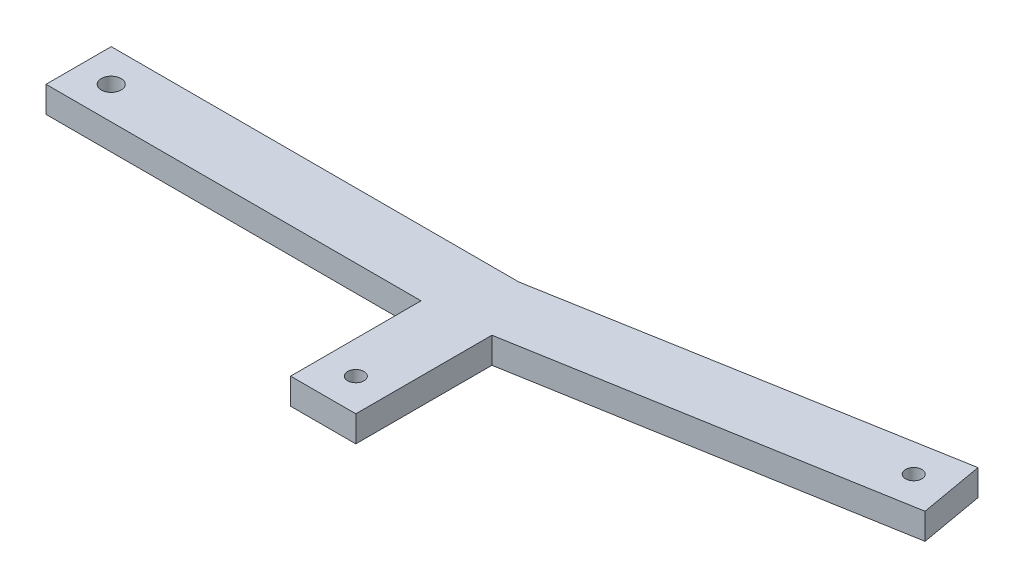
ISO-10303-21;
HEADER;
FILE_DESCRIPTION(('STEP AP214'),'2;1');
FILE_NAME('part.step','',(''),(''),'','','');
FILE_SCHEMA(('AUTOMOTIVE_DESIGN { 1 0 10303 214 1 1 1 1 }'));
ENDSEC;
DATA;
#1=APPLICATION_CONTEXT('core data for automotive mechanical design processes');
#2=APPLICATION_PROTOCOL_DEFINITION('international standard','automotive_design',2000,#1);
#3=PRODUCT_CONTEXT('',#1,'mechanical');
#4=PRODUCT('Part','Part','',(#3));
#5=PRODUCT_RELATED_PRODUCT_CATEGORY('part','',(#4));
#6=PRODUCT_DEFINITION_FORMATION('','',#4);
#7=PRODUCT_DEFINITION_CONTEXT('part definition',#1,'design');
#8=PRODUCT_DEFINITION('design','',#6,#7);
#9=PRODUCT_DEFINITION_SHAPE('','',#8);
#10=(LENGTH_UNIT() NAMED_UNIT(*) SI_UNIT(.MILLI.,.METRE.));
#11=(NAMED_UNIT(*) PLANE_ANGLE_UNIT() SI_UNIT($,.RADIAN.));
#12=(NAMED_UNIT(*) SI_UNIT($,.STERADIAN.) SOLID_ANGLE_UNIT());
#13=UNCERTAINTY_MEASURE_WITH_UNIT(LENGTH_MEASURE(1.E-05),#10,'distance_accuracy_value','');
#14=(GEOMETRIC_REPRESENTATION_CONTEXT(3) GLOBAL_UNCERTAINTY_ASSIGNED_CONTEXT((#13)) GLOBAL_UNIT_ASSIGNED_CONTEXT((#10,
#11,#12)) REPRESENTATION_CONTEXT('',''));
#15=CARTESIAN_POINT('',(0.,0.,0.));
#16=DIRECTION('',(0.,0.,1.));
#17=DIRECTION('',(1.,0.,0.));
#18=AXIS2_PLACEMENT_3D('',#15,#16,#17);
#19=CARTESIAN_POINT('',(0.,8.,0.));
#20=DIRECTION('',(0.,-1.,0.));
#21=DIRECTION('',(0.,0.,-1.));
#22=AXIS2_PLACEMENT_3D('',#19,#20,#21);
#23=PLANE('',#22);
#24=CARTESIAN_POINT('',(-39.1381945492979,8.,0.));
#25=DIRECTION('',(0.,1.,0.));
#26=DIRECTION('',(0.,0.,1.));
#27=AXIS2_PLACEMENT_3D('',#24,#25,#26);
#28=CIRCLE('',#27,3.05);
#29=CARTESIAN_POINT('',(-39.1381945492979,8.,3.05));
#30=VERTEX_POINT('',#29);
#31=EDGE_CURVE('E198',#30,#30,#28,.T.);
#32=ORIENTED_EDGE('',*,*,#31,.F.);
#33=EDGE_LOOP('',(#32));
#34=FACE_BOUND('',#33,.T.);
#35=DIRECTION('',(-1.,0.,0.));
#36=VECTOR('',#35,1.);
#37=CARTESIAN_POINT('',(75.8618054507021,8.,-10.));
#38=LINE('',#37,#36);
#39=CARTESIAN_POINT('',(75.8618054507021,8.,-10.));
#40=VERTEX_POINT('',#39);
#41=CARTESIAN_POINT('',(-49.1381945492979,8.,-10.));
#42=VERTEX_POINT('',#41);
#43=EDGE_CURVE('E154',#40,#42,#38,.T.);
#44=ORIENTED_EDGE('',*,*,#43,.T.);
#45=DIRECTION('',(0.,0.,1.));
#46=VECTOR('',#45,1.);
#47=CARTESIAN_POINT('',(-49.1381945492979,8.,10.));
#48=LINE('',#47,#46);
#49=CARTESIAN_POINT('',(-49.1381945492979,8.,10.));
#50=VERTEX_POINT('',#49);
#51=EDGE_CURVE('E96',#42,#50,#48,.T.);
#52=ORIENTED_EDGE('',*,*,#51,.T.);
#53=DIRECTION('',(1.,0.,0.));
#54=VECTOR('',#53,1.);
#55=CARTESIAN_POINT('',(65.8618054507021,8.,9.99999999999999));
#56=LINE('',#55,#54);
#57=CARTESIAN_POINT('',(65.8618054507021,8.,9.99999999999999));
#58=VERTEX_POINT('',#57);
#59=EDGE_CURVE('E172',#50,#58,#56,.T.);
#60=ORIENTED_EDGE('',*,*,#59,.T.);
#61=DIRECTION('',(0.,0.,1.));
#62=VECTOR('',#61,1.);
#63=CARTESIAN_POINT('',(65.8618054507021,8.,50.));
#64=LINE('',#63,#62);
#65=CARTESIAN_POINT('',(65.8618054507021,8.,50.));
#66=VERTEX_POINT('',#65);
#67=EDGE_CURVE('E188',#58,#66,#64,.T.);
#68=ORIENTED_EDGE('',*,*,#67,.T.);
#69=DIRECTION('',(1.,0.,0.));
#70=VECTOR('',#69,1.);
#71=CARTESIAN_POINT('',(75.8618054507021,8.,50.));
#72=LINE('',#71,#70);
#73=CARTESIAN_POINT('',(85.8618054507021,8.,50.));
#74=VERTEX_POINT('',#73);
#75=EDGE_CURVE('E187',#66,#74,#72,.T.);
#76=ORIENTED_EDGE('',*,*,#75,.T.);
#77=DIRECTION('',(0.,0.,-1.));
#78=VECTOR('',#77,1.);
#79=CARTESIAN_POINT('',(85.8618054507021,8.,50.));
#80=LINE('',#79,#78);
#81=CARTESIAN_POINT('',(85.8618054507021,8.,8.26328529359308));
#82=VERTEX_POINT('',#81);
#83=EDGE_CURVE('E118',#74,#82,#80,.T.);
#84=ORIENTED_EDGE('',*,*,#83,.T.);
#85=DIRECTION('',(0.985251905584883,0.,-0.171110147394471));
#86=VECTOR('',#85,1.);
#87=CARTESIAN_POINT('',(85.8618054507021,8.,8.26328529359308));
#88=LINE('',#87,#86);
#89=CARTESIAN_POINT('',(199.018293648812,8.,-11.3887684243089));
#90=VERTEX_POINT('',#89);
#91=EDGE_CURVE('E112',#82,#90,#88,.T.);
#92=ORIENTED_EDGE('',*,*,#91,.T.);
#93=DIRECTION('',(-0.173648177666931,0.,-0.984807753012208));
#94=VECTOR('',#93,1.);
#95=CARTESIAN_POINT('',(195.542164518357,8.,-31.1028763645046));
#96=LINE('',#95,#94);
#97=CARTESIAN_POINT('',(195.542164518357,8.,-31.1028763645046));
#98=VERTEX_POINT('',#97);
#99=EDGE_CURVE('E116',#90,#98,#96,.T.);
#100=ORIENTED_EDGE('',*,*,#99,.T.);
#101=DIRECTION('',(-0.984807753012208,0.,0.173648177666931));
#102=VECTOR('',#101,1.);
#103=CARTESIAN_POINT('',(75.8618054507021,8.,-10.));
#104=LINE('',#103,#102);
#105=EDGE_CURVE('E50',#98,#40,#104,.T.);
#106=ORIENTED_EDGE('',*,*,#105,.T.);
#107=EDGE_LOOP('',(#44,#52,#60,#68,#76,#84,#92,#100,#106));
#108=FACE_BOUND('',#107,.T.);
#109=CARTESIAN_POINT('',(75.8618054507021,8.,40.));
#110=DIRECTION('',(0.,1.,0.));
#111=DIRECTION('',(0.,0.,1.));
#112=AXIS2_PLACEMENT_3D('',#109,#110,#111);
#113=CIRCLE('',#112,2.5);
#114=CARTESIAN_POINT('',(75.8618054507021,8.,42.5));
#115=VERTEX_POINT('',#114);
#116=EDGE_CURVE('E140',#115,#115,#113,.T.);
#117=ORIENTED_EDGE('',*,*,#116,.F.);
#118=EDGE_LOOP('',(#117));
#119=FACE_BOUND('',#118,.T.);
#120=CARTESIAN_POINT('',(187.432151553463,8.,-19.5093406177375));
#121=DIRECTION('',(0.,1.,0.));
#122=DIRECTION('',(0.,0.,1.));
#123=AXIS2_PLACEMENT_3D('',#120,#121,#122);
#124=CIRCLE('',#123,2.5);
#125=CARTESIAN_POINT('',(187.432151553463,8.,-17.0093406177375));
#126=VERTEX_POINT('',#125);
#127=EDGE_CURVE('E204',#126,#126,#124,.T.);
#128=ORIENTED_EDGE('',*,*,#127,.F.);
#129=EDGE_LOOP('',(#128));
#130=FACE_BOUND('',#129,.T.);
#131=ADVANCED_FACE('F33',(#34,#108,#119,#130),#23,.F.);
#132=CARTESIAN_POINT('',(0.,0.,0.));
#133=DIRECTION('',(0.,-1.,0.));
#134=DIRECTION('',(0.,0.,-1.));
#135=AXIS2_PLACEMENT_3D('',#132,#133,#134);
#136=PLANE('',#135);
#137=CARTESIAN_POINT('',(-39.1381945492979,0.,0.));
#138=DIRECTION('',(0.,1.,0.));
#139=DIRECTION('',(0.,0.,1.));
#140=AXIS2_PLACEMENT_3D('',#137,#138,#139);
#141=CIRCLE('',#140,3.05);
#142=CARTESIAN_POINT('',(-39.1381945492979,0.,3.05));
#143=VERTEX_POINT('',#142);
#144=EDGE_CURVE('E201',#143,#143,#141,.T.);
#145=ORIENTED_EDGE('',*,*,#144,.T.);
#146=EDGE_LOOP('',(#145));
#147=FACE_BOUND('',#146,.T.);
#148=DIRECTION('',(-1.,0.,0.));
#149=VECTOR('',#148,1.);
#150=CARTESIAN_POINT('',(75.8618054507021,0.,-10.));
#151=LINE('',#150,#149);
#152=CARTESIAN_POINT('',(75.8618054507021,0.,-10.));
#153=VERTEX_POINT('',#152);
#154=CARTESIAN_POINT('',(-49.1381945492979,0.,-10.));
#155=VERTEX_POINT('',#154);
#156=EDGE_CURVE('E136',#153,#155,#151,.T.);
#157=ORIENTED_EDGE('',*,*,#156,.F.);
#158=DIRECTION('',(-0.984807753012208,0.,0.173648177666931));
#159=VECTOR('',#158,1.);
#160=CARTESIAN_POINT('',(75.8618054507021,0.,-10.));
#161=LINE('',#160,#159);
#162=CARTESIAN_POINT('',(195.542164518357,0.,-31.1028763645046));
#163=VERTEX_POINT('',#162);
#164=EDGE_CURVE('E88',#163,#153,#161,.T.);
#165=ORIENTED_EDGE('',*,*,#164,.F.);
#166=DIRECTION('',(-0.173648177666931,0.,-0.984807753012208));
#167=VECTOR('',#166,1.);
#168=CARTESIAN_POINT('',(195.542164518357,0.,-31.1028763645046));
#169=LINE('',#168,#167);
#170=CARTESIAN_POINT('',(199.018293648812,0.,-11.3887684243089));
#171=VERTEX_POINT('',#170);
#172=EDGE_CURVE('E82',#171,#163,#169,.T.);
#173=ORIENTED_EDGE('',*,*,#172,.F.);
#174=DIRECTION('',(0.985251905584883,0.,-0.171110147394471));
#175=VECTOR('',#174,1.);
#176=CARTESIAN_POINT('',(85.8618054507021,0.,8.26328529359308));
#177=LINE('',#176,#175);
#178=CARTESIAN_POINT('',(85.8618054507021,0.,8.26328529359308));
#179=VERTEX_POINT('',#178);
#180=EDGE_CURVE('E126',#179,#171,#177,.T.);
#181=ORIENTED_EDGE('',*,*,#180,.F.);
#182=DIRECTION('',(0.,0.,-1.));
#183=VECTOR('',#182,1.);
#184=CARTESIAN_POINT('',(85.8618054507021,0.,50.));
#185=LINE('',#184,#183);
#186=CARTESIAN_POINT('',(85.8618054507021,0.,50.));
#187=VERTEX_POINT('',#186);
#188=EDGE_CURVE('E149',#187,#179,#185,.T.);
#189=ORIENTED_EDGE('',*,*,#188,.F.);
#190=DIRECTION('',(1.,0.,0.));
#191=VECTOR('',#190,1.);
#192=CARTESIAN_POINT('',(75.8618054507021,0.,50.));
#193=LINE('',#192,#191);
#194=CARTESIAN_POINT('',(65.8618054507021,0.,50.));
#195=VERTEX_POINT('',#194);
#196=EDGE_CURVE('E147',#195,#187,#193,.T.);
#197=ORIENTED_EDGE('',*,*,#196,.F.);
#198=DIRECTION('',(0.,0.,1.));
#199=VECTOR('',#198,1.);
#200=CARTESIAN_POINT('',(65.8618054507021,0.,50.));
#201=LINE('',#200,#199);
#202=CARTESIAN_POINT('',(65.8618054507021,0.,9.99999999999999));
#203=VERTEX_POINT('',#202);
#204=EDGE_CURVE('E144',#203,#195,#201,.T.);
#205=ORIENTED_EDGE('',*,*,#204,.F.);
#206=DIRECTION('',(1.,0.,0.));
#207=VECTOR('',#206,1.);
#208=CARTESIAN_POINT('',(65.8618054507021,0.,9.99999999999999));
#209=LINE('',#208,#207);
#210=CARTESIAN_POINT('',(-49.1381945492979,0.,10.));
#211=VERTEX_POINT('',#210);
#212=EDGE_CURVE('E142',#211,#203,#209,.T.);
#213=ORIENTED_EDGE('',*,*,#212,.F.);
#214=DIRECTION('',(0.,0.,1.));
#215=VECTOR('',#214,1.);
#216=CARTESIAN_POINT('',(-49.1381945492979,0.,10.));
#217=LINE('',#216,#215);
#218=EDGE_CURVE('E139',#155,#211,#217,.T.);
#219=ORIENTED_EDGE('',*,*,#218,.F.);
#220=EDGE_LOOP('',(#157,#165,#173,#181,#189,#197,#205,#213,#219));
#221=FACE_BOUND('',#220,.T.);
#222=CARTESIAN_POINT('',(75.8618054507021,0.,40.));
#223=DIRECTION('',(0.,1.,0.));
#224=DIRECTION('',(0.,0.,1.));
#225=AXIS2_PLACEMENT_3D('',#222,#223,#224);
#226=CIRCLE('',#225,2.5);
#227=CARTESIAN_POINT('',(75.8618054507021,0.,42.5));
#228=VERTEX_POINT('',#227);
#229=EDGE_CURVE('E195',#228,#228,#226,.T.);
#230=ORIENTED_EDGE('',*,*,#229,.T.);
#231=EDGE_LOOP('',(#230));
#232=FACE_BOUND('',#231,.T.);
#233=CARTESIAN_POINT('',(187.432151553463,0.,-19.5093406177375));
#234=DIRECTION('',(0.,1.,0.));
#235=DIRECTION('',(0.,0.,1.));
#236=AXIS2_PLACEMENT_3D('',#233,#234,#235);
#237=CIRCLE('',#236,2.5);
#238=CARTESIAN_POINT('',(187.432151553463,0.,-17.0093406177375));
#239=VERTEX_POINT('',#238);
#240=EDGE_CURVE('E207',#239,#239,#237,.T.);
#241=ORIENTED_EDGE('',*,*,#240,.T.);
#242=EDGE_LOOP('',(#241));
#243=FACE_BOUND('',#242,.T.);
#244=ADVANCED_FACE('F176',(#147,#221,#232,#243),#136,.T.);
#245=CARTESIAN_POINT('',(75.8618054507021,8.,-10.));
#246=DIRECTION('',(0.,0.,1.));
#247=DIRECTION('',(1.,0.,0.));
#248=AXIS2_PLACEMENT_3D('',#245,#246,#247);
#249=PLANE('',#248);
#250=ORIENTED_EDGE('',*,*,#156,.T.);
#251=DIRECTION('',(0.,-1.,0.));
#252=VECTOR('',#251,1.);
#253=CARTESIAN_POINT('',(-49.1381945492979,8.,-10.));
#254=LINE('',#253,#252);
#255=EDGE_CURVE('E11',#42,#155,#254,.T.);
#256=ORIENTED_EDGE('',*,*,#255,.F.);
#257=ORIENTED_EDGE('',*,*,#43,.F.);
#258=DIRECTION('',(0.,-1.,0.));
#259=VECTOR('',#258,1.);
#260=CARTESIAN_POINT('',(75.8618054507021,8.,-10.));
#261=LINE('',#260,#259);
#262=EDGE_CURVE('E132',#40,#153,#261,.T.);
#263=ORIENTED_EDGE('',*,*,#262,.T.);
#264=EDGE_LOOP('',(#250,#256,#257,#263));
#265=FACE_BOUND('',#264,.T.);
#266=ADVANCED_FACE('F35',(#265),#249,.F.);
#267=CARTESIAN_POINT('',(-49.1381945492979,8.,10.));
#268=DIRECTION('',(1.,0.,0.));
#269=DIRECTION('',(0.,0.,-1.));
#270=AXIS2_PLACEMENT_3D('',#267,#268,#269);
#271=PLANE('',#270);
#272=ORIENTED_EDGE('',*,*,#218,.T.);
#273=DIRECTION('',(0.,-1.,0.));
#274=VECTOR('',#273,1.);
#275=CARTESIAN_POINT('',(-49.1381945492979,8.,10.));
#276=LINE('',#275,#274);
#277=EDGE_CURVE('E42',#50,#211,#276,.T.);
#278=ORIENTED_EDGE('',*,*,#277,.F.);
#279=ORIENTED_EDGE('',*,*,#51,.F.);
#280=ORIENTED_EDGE('',*,*,#255,.T.);
#281=EDGE_LOOP('',(#272,#278,#279,#280));
#282=FACE_BOUND('',#281,.T.);
#283=ADVANCED_FACE('F245',(#282),#271,.F.);
#284=CARTESIAN_POINT('',(65.8618054507021,8.,9.99999999999999));
#285=DIRECTION('',(0.,0.,-1.));
#286=DIRECTION('',(-1.,0.,0.));
#287=AXIS2_PLACEMENT_3D('',#284,#285,#286);
#288=PLANE('',#287);
#289=ORIENTED_EDGE('',*,*,#212,.T.);
#290=DIRECTION('',(0.,-1.,0.));
#291=VECTOR('',#290,1.);
#292=CARTESIAN_POINT('',(65.8618054507021,8.,9.99999999999999));
#293=LINE('',#292,#291);
#294=EDGE_CURVE('E164',#58,#203,#293,.T.);
#295=ORIENTED_EDGE('',*,*,#294,.F.);
#296=ORIENTED_EDGE('',*,*,#59,.F.);
#297=ORIENTED_EDGE('',*,*,#277,.T.);
#298=EDGE_LOOP('',(#289,#295,#296,#297));
#299=FACE_BOUND('',#298,.T.);
#300=ADVANCED_FACE('F170',(#299),#288,.F.);
#301=CARTESIAN_POINT('',(65.8618054507021,8.,50.));
#302=DIRECTION('',(1.,0.,0.));
#303=DIRECTION('',(0.,0.,-1.));
#304=AXIS2_PLACEMENT_3D('',#301,#302,#303);
#305=PLANE('',#304);
#306=ORIENTED_EDGE('',*,*,#204,.T.);
#307=DIRECTION('',(0.,-1.,0.));
#308=VECTOR('',#307,1.);
#309=CARTESIAN_POINT('',(65.8618054507021,8.,50.));
#310=LINE('',#309,#308);
#311=EDGE_CURVE('E161',#66,#195,#310,.T.);
#312=ORIENTED_EDGE('',*,*,#311,.F.);
#313=ORIENTED_EDGE('',*,*,#67,.F.);
#314=ORIENTED_EDGE('',*,*,#294,.T.);
#315=EDGE_LOOP('',(#306,#312,#313,#314));
#316=FACE_BOUND('',#315,.T.);
#317=ADVANCED_FACE('F181',(#316),#305,.F.);
#318=CARTESIAN_POINT('',(75.8618054507021,8.,50.));
#319=DIRECTION('',(0.,0.,-1.));
#320=DIRECTION('',(-1.,0.,0.));
#321=AXIS2_PLACEMENT_3D('',#318,#319,#320);
#322=PLANE('',#321);
#323=ORIENTED_EDGE('',*,*,#196,.T.);
#324=DIRECTION('',(0.,-1.,0.));
#325=VECTOR('',#324,1.);
#326=CARTESIAN_POINT('',(85.8618054507021,8.,50.));
#327=LINE('',#326,#325);
#328=EDGE_CURVE('E158',#74,#187,#327,.T.);
#329=ORIENTED_EDGE('',*,*,#328,.F.);
#330=ORIENTED_EDGE('',*,*,#75,.F.);
#331=ORIENTED_EDGE('',*,*,#311,.T.);
#332=EDGE_LOOP('',(#323,#329,#330,#331));
#333=FACE_BOUND('',#332,.T.);
#334=ADVANCED_FACE('F185',(#333),#322,.F.);
#335=CARTESIAN_POINT('',(85.8618054507021,8.,50.));
#336=DIRECTION('',(-1.,0.,0.));
#337=DIRECTION('',(0.,0.,1.));
#338=AXIS2_PLACEMENT_3D('',#335,#336,#337);
#339=PLANE('',#338);
#340=ORIENTED_EDGE('',*,*,#188,.T.);
#341=DIRECTION('',(0.,-1.,0.));
#342=VECTOR('',#341,1.);
#343=CARTESIAN_POINT('',(85.8618054507021,8.,8.26328529359308));
#344=LINE('',#343,#342);
#345=EDGE_CURVE('E127',#82,#179,#344,.T.);
#346=ORIENTED_EDGE('',*,*,#345,.F.);
#347=ORIENTED_EDGE('',*,*,#83,.F.);
#348=ORIENTED_EDGE('',*,*,#328,.T.);
#349=EDGE_LOOP('',(#340,#346,#347,#348));
#350=FACE_BOUND('',#349,.T.);
#351=ADVANCED_FACE('F236',(#350),#339,.F.);
#352=CARTESIAN_POINT('',(85.8618054507021,8.,8.26328529359308));
#353=DIRECTION('',(-0.171110147394471,0.,-0.985251905584883));
#354=DIRECTION('',(-0.985251905584883,0.,0.171110147394471));
#355=AXIS2_PLACEMENT_3D('',#352,#353,#354);
#356=PLANE('',#355);
#357=ORIENTED_EDGE('',*,*,#180,.T.);
#358=DIRECTION('',(0.,-1.,0.));
#359=VECTOR('',#358,1.);
#360=CARTESIAN_POINT('',(199.018293648812,8.,-11.3887684243089));
#361=LINE('',#360,#359);
#362=EDGE_CURVE('E123',#90,#171,#361,.T.);
#363=ORIENTED_EDGE('',*,*,#362,.F.);
#364=ORIENTED_EDGE('',*,*,#91,.F.);
#365=ORIENTED_EDGE('',*,*,#345,.T.);
#366=EDGE_LOOP('',(#357,#363,#364,#365));
#367=FACE_BOUND('',#366,.T.);
#368=ADVANCED_FACE('F124',(#367),#356,.F.);
#369=CARTESIAN_POINT('',(195.542164518357,8.,-31.1028763645046));
#370=DIRECTION('',(-0.984807753012208,0.,0.173648177666931));
#371=DIRECTION('',(0.173648177666931,0.,0.984807753012208));
#372=AXIS2_PLACEMENT_3D('',#369,#370,#371);
#373=PLANE('',#372);
#374=ORIENTED_EDGE('',*,*,#172,.T.);
#375=DIRECTION('',(0.,-1.,0.));
#376=VECTOR('',#375,1.);
#377=CARTESIAN_POINT('',(195.542164518357,8.,-31.1028763645046));
#378=LINE('',#377,#376);
#379=EDGE_CURVE('E128',#98,#163,#378,.T.);
#380=ORIENTED_EDGE('',*,*,#379,.F.);
#381=ORIENTED_EDGE('',*,*,#99,.F.);
#382=ORIENTED_EDGE('',*,*,#362,.T.);
#383=EDGE_LOOP('',(#374,#380,#381,#382));
#384=FACE_BOUND('',#383,.T.);
#385=ADVANCED_FACE('F130',(#384),#373,.F.);
#386=CARTESIAN_POINT('',(75.8618054507021,8.,-10.));
#387=DIRECTION('',(0.173648177666931,0.,0.984807753012208));
#388=DIRECTION('',(0.984807753012208,0.,-0.173648177666931));
#389=AXIS2_PLACEMENT_3D('',#386,#387,#388);
#390=PLANE('',#389);
#391=ORIENTED_EDGE('',*,*,#164,.T.);
#392=ORIENTED_EDGE('',*,*,#262,.F.);
#393=ORIENTED_EDGE('',*,*,#105,.F.);
#394=ORIENTED_EDGE('',*,*,#379,.T.);
#395=EDGE_LOOP('',(#391,#392,#393,#394));
#396=FACE_BOUND('',#395,.T.);
#397=ADVANCED_FACE('F229',(#396),#390,.F.);
#398=CARTESIAN_POINT('',(75.8618054507021,8.,40.));
#399=DIRECTION('',(0.,-1.,0.));
#400=DIRECTION('',(0.,0.,-1.));
#401=AXIS2_PLACEMENT_3D('',#398,#399,#400);
#402=CYLINDRICAL_SURFACE('',#401,2.5);
#403=ORIENTED_EDGE('',*,*,#116,.T.);
#404=EDGE_LOOP('',(#403));
#405=FACE_BOUND('',#404,.T.);
#406=ORIENTED_EDGE('',*,*,#229,.F.);
#407=EDGE_LOOP('',(#406));
#408=FACE_BOUND('',#407,.T.);
#409=ADVANCED_FACE('F226',(#405,#408),#402,.F.);
#410=CARTESIAN_POINT('',(-39.1381945492979,8.,0.));
#411=DIRECTION('',(0.,-1.,0.));
#412=DIRECTION('',(0.,0.,-1.));
#413=AXIS2_PLACEMENT_3D('',#410,#411,#412);
#414=CYLINDRICAL_SURFACE('',#413,3.05);
#415=ORIENTED_EDGE('',*,*,#31,.T.);
#416=EDGE_LOOP('',(#415));
#417=FACE_BOUND('',#416,.T.);
#418=ORIENTED_EDGE('',*,*,#144,.F.);
#419=EDGE_LOOP('',(#418));
#420=FACE_BOUND('',#419,.T.);
#421=ADVANCED_FACE('F317',(#417,#420),#414,.F.);
#422=CARTESIAN_POINT('',(187.432151553463,8.,-19.5093406177375));
#423=DIRECTION('',(0.,-1.,0.));
#424=DIRECTION('',(0.,0.,-1.));
#425=AXIS2_PLACEMENT_3D('',#422,#423,#424);
#426=CYLINDRICAL_SURFACE('',#425,2.5);
#427=ORIENTED_EDGE('',*,*,#127,.T.);
#428=EDGE_LOOP('',(#427));
#429=FACE_BOUND('',#428,.T.);
#430=ORIENTED_EDGE('',*,*,#240,.F.);
#431=EDGE_LOOP('',(#430));
#432=FACE_BOUND('',#431,.T.);
#433=ADVANCED_FACE('F213',(#429,#432),#426,.F.);
#434=CLOSED_SHELL('',(#131,#244,#266,#283,#300,#317,#334,#351,#368,#385,#397,#409,#421,#433));
#435=MANIFOLD_SOLID_BREP('B2',#434);
#436=ADVANCED_BREP_SHAPE_REPRESENTATION('',(#18,#435),#14);
#437=SHAPE_DEFINITION_REPRESENTATION(#9,#436);
ENDSEC;
END-ISO-10303-21;
